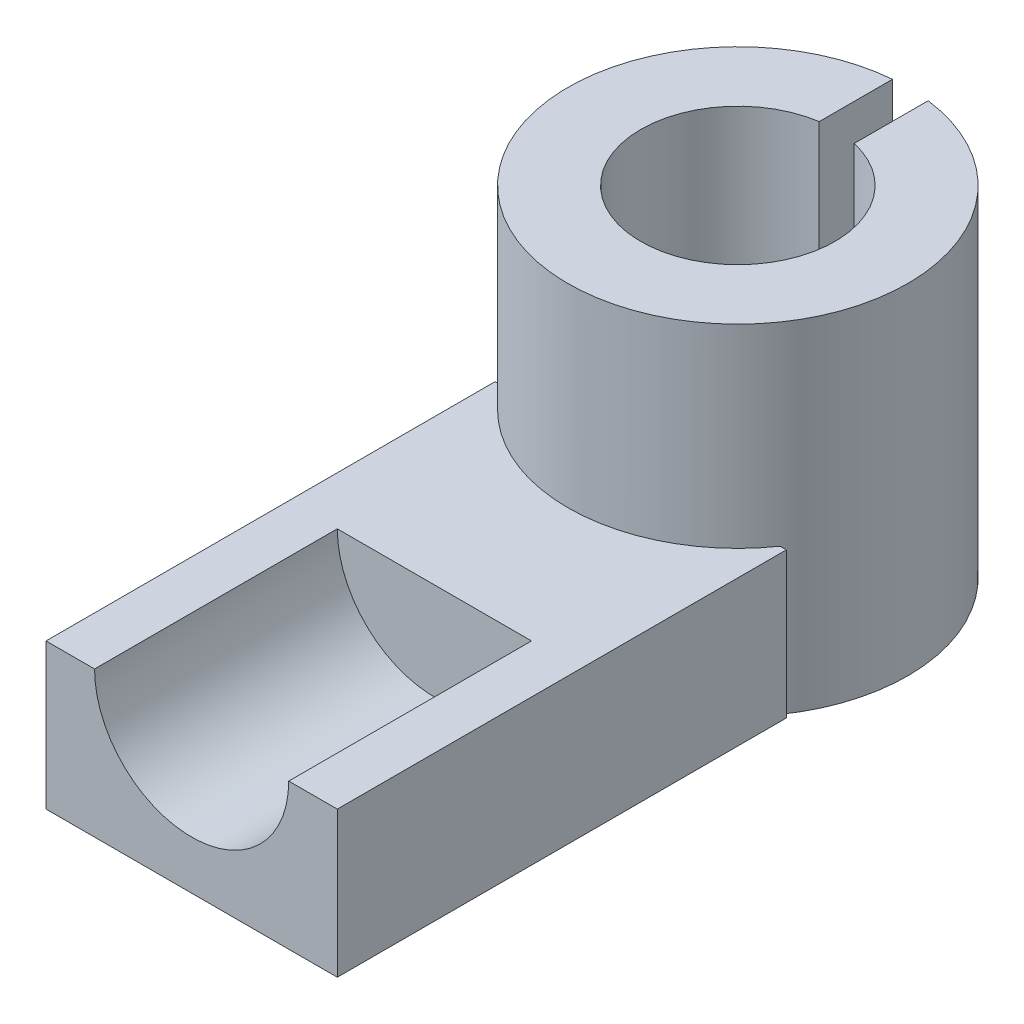
ISO-10303-21;
HEADER;
FILE_DESCRIPTION(('STEP AP214'),'2;1');
FILE_NAME('part.step','',(''),(''),'','','');
FILE_SCHEMA(('AUTOMOTIVE_DESIGN { 1 0 10303 214 1 1 1 1 }'));
ENDSEC;
DATA;
#1=APPLICATION_CONTEXT('core data for automotive mechanical design processes');
#2=APPLICATION_PROTOCOL_DEFINITION('international standard','automotive_design',2000,#1);
#3=PRODUCT_CONTEXT('',#1,'mechanical');
#4=PRODUCT('Part','Part','',(#3));
#5=PRODUCT_RELATED_PRODUCT_CATEGORY('part','',(#4));
#6=PRODUCT_DEFINITION_FORMATION('','',#4);
#7=PRODUCT_DEFINITION_CONTEXT('part definition',#1,'design');
#8=PRODUCT_DEFINITION('design','',#6,#7);
#9=PRODUCT_DEFINITION_SHAPE('','',#8);
#10=(LENGTH_UNIT() NAMED_UNIT(*) SI_UNIT(.MILLI.,.METRE.));
#11=(NAMED_UNIT(*) PLANE_ANGLE_UNIT() SI_UNIT($,.RADIAN.));
#12=(NAMED_UNIT(*) SI_UNIT($,.STERADIAN.) SOLID_ANGLE_UNIT());
#13=UNCERTAINTY_MEASURE_WITH_UNIT(LENGTH_MEASURE(1.E-05),#10,'distance_accuracy_value','');
#14=(GEOMETRIC_REPRESENTATION_CONTEXT(3) GLOBAL_UNCERTAINTY_ASSIGNED_CONTEXT((#13)) GLOBAL_UNIT_ASSIGNED_CONTEXT((#10,
#11,#12)) REPRESENTATION_CONTEXT('',''));
#15=CARTESIAN_POINT('',(0.,0.,0.));
#16=DIRECTION('',(0.,0.,1.));
#17=DIRECTION('',(1.,0.,0.));
#18=AXIS2_PLACEMENT_3D('',#15,#16,#17);
#19=CARTESIAN_POINT('',(-24.,24.,90.));
#20=DIRECTION('',(0.,0.,1.));
#21=DIRECTION('',(1.,0.,0.));
#22=AXIS2_PLACEMENT_3D('',#19,#20,#21);
#23=PLANE('',#22);
#24=DIRECTION('',(-1.,0.,0.));
#25=VECTOR('',#24,1.);
#26=CARTESIAN_POINT('',(-24.,24.,90.));
#27=LINE('',#26,#25);
#28=CARTESIAN_POINT('',(24.,24.,90.));
#29=VERTEX_POINT('',#28);
#30=CARTESIAN_POINT('',(16.,24.,90.));
#31=VERTEX_POINT('',#30);
#32=EDGE_CURVE('E165',#29,#31,#27,.T.);
#33=ORIENTED_EDGE('',*,*,#32,.T.);
#34=CARTESIAN_POINT('',(0.,24.,90.));
#35=DIRECTION('',(0.,0.,1.));
#36=DIRECTION('',(1.,0.,0.));
#37=AXIS2_PLACEMENT_3D('',#34,#35,#36);
#38=CIRCLE('',#37,16.);
#39=CARTESIAN_POINT('',(-16.,24.,90.));
#40=VERTEX_POINT('',#39);
#41=EDGE_CURVE('E63',#40,#31,#38,.T.);
#42=ORIENTED_EDGE('',*,*,#41,.F.);
#43=CARTESIAN_POINT('',(-24.,24.,90.));
#44=VERTEX_POINT('',#43);
#45=EDGE_CURVE('E130',#40,#44,#27,.T.);
#46=ORIENTED_EDGE('',*,*,#45,.T.);
#47=DIRECTION('',(0.,-1.,0.));
#48=VECTOR('',#47,1.);
#49=CARTESIAN_POINT('',(-24.,24.,90.));
#50=LINE('',#49,#48);
#51=CARTESIAN_POINT('',(-24.,0.,90.));
#52=VERTEX_POINT('',#51);
#53=EDGE_CURVE('E184',#44,#52,#50,.T.);
#54=ORIENTED_EDGE('',*,*,#53,.T.);
#55=DIRECTION('',(-1.,0.,0.));
#56=VECTOR('',#55,1.);
#57=CARTESIAN_POINT('',(-24.,0.,90.));
#58=LINE('',#57,#56);
#59=CARTESIAN_POINT('',(24.,0.,90.));
#60=VERTEX_POINT('',#59);
#61=EDGE_CURVE('E156',#60,#52,#58,.T.);
#62=ORIENTED_EDGE('',*,*,#61,.F.);
#63=DIRECTION('',(0.,-1.,0.));
#64=VECTOR('',#63,1.);
#65=CARTESIAN_POINT('',(24.,24.,90.));
#66=LINE('',#65,#64);
#67=EDGE_CURVE('E188',#29,#60,#66,.T.);
#68=ORIENTED_EDGE('',*,*,#67,.F.);
#69=EDGE_LOOP('',(#33,#42,#46,#54,#62,#68));
#70=FACE_BOUND('',#69,.T.);
#71=ADVANCED_FACE('F39',(#70),#23,.T.);
#72=CARTESIAN_POINT('',(0.,24.,0.));
#73=DIRECTION('',(0.,-1.,0.));
#74=DIRECTION('',(0.,0.,-1.));
#75=AXIS2_PLACEMENT_3D('',#72,#73,#74);
#76=PLANE('',#75);
#77=DIRECTION('',(0.,0.,-1.));
#78=VECTOR('',#77,1.);
#79=CARTESIAN_POINT('',(-16.,24.,414.903726190688));
#80=LINE('',#79,#78);
#81=CARTESIAN_POINT('',(-16.,24.,50.));
#82=VERTEX_POINT('',#81);
#83=EDGE_CURVE('E127',#40,#82,#80,.T.);
#84=ORIENTED_EDGE('',*,*,#83,.T.);
#85=DIRECTION('',(-1.,0.,0.));
#86=VECTOR('',#85,1.);
#87=CARTESIAN_POINT('',(-24.,24.,50.));
#88=LINE('',#87,#86);
#89=CARTESIAN_POINT('',(16.,24.,50.));
#90=VERTEX_POINT('',#89);
#91=EDGE_CURVE('E55',#90,#82,#88,.T.);
#92=ORIENTED_EDGE('',*,*,#91,.F.);
#93=DIRECTION('',(0.,0.,-1.));
#94=VECTOR('',#93,1.);
#95=CARTESIAN_POINT('',(16.,24.,414.903726190688));
#96=LINE('',#95,#94);
#97=EDGE_CURVE('E134',#31,#90,#96,.T.);
#98=ORIENTED_EDGE('',*,*,#97,.F.);
#99=ORIENTED_EDGE('',*,*,#32,.F.);
#100=DIRECTION('',(0.,0.,1.));
#101=VECTOR('',#100,1.);
#102=CARTESIAN_POINT('',(24.,24.,90.));
#103=LINE('',#102,#101);
#104=CARTESIAN_POINT('',(24.,24.,16.));
#105=VERTEX_POINT('',#104);
#106=EDGE_CURVE('E161',#105,#29,#103,.T.);
#107=ORIENTED_EDGE('',*,*,#106,.F.);
#108=DIRECTION('',(1.,0.,0.));
#109=VECTOR('',#108,1.);
#110=CARTESIAN_POINT('',(-24.,24.,16.));
#111=LINE('',#110,#109);
#112=CARTESIAN_POINT('',(22.9782505861521,24.,16.));
#113=VERTEX_POINT('',#112);
#114=EDGE_CURVE('E155',#113,#105,#111,.T.);
#115=ORIENTED_EDGE('',*,*,#114,.F.);
#116=CARTESIAN_POINT('',(0.,24.,0.));
#117=DIRECTION('',(0.,-1.,0.));
#118=DIRECTION('',(0.,0.,-1.));
#119=AXIS2_PLACEMENT_3D('',#116,#117,#118);
#120=CIRCLE('',#119,28.);
#121=CARTESIAN_POINT('',(-22.9782505861521,24.,16.));
#122=VERTEX_POINT('',#121);
#123=EDGE_CURVE('E187',#113,#122,#120,.T.);
#124=ORIENTED_EDGE('',*,*,#123,.T.);
#125=CARTESIAN_POINT('',(-24.,24.,16.));
#126=VERTEX_POINT('',#125);
#127=EDGE_CURVE('E157',#126,#122,#111,.T.);
#128=ORIENTED_EDGE('',*,*,#127,.F.);
#129=DIRECTION('',(0.,0.,-1.));
#130=VECTOR('',#129,1.);
#131=CARTESIAN_POINT('',(-24.,24.,90.));
#132=LINE('',#131,#130);
#133=EDGE_CURVE('E151',#44,#126,#132,.T.);
#134=ORIENTED_EDGE('',*,*,#133,.F.);
#135=ORIENTED_EDGE('',*,*,#45,.F.);
#136=EDGE_LOOP('',(#84,#92,#98,#99,#107,#115,#124,#128,#134,#135));
#137=FACE_BOUND('',#136,.T.);
#138=ADVANCED_FACE('F128',(#137),#76,.F.);
#139=CARTESIAN_POINT('',(0.,56.,0.));
#140=DIRECTION('',(0.,1.,0.));
#141=DIRECTION('',(0.,0.,1.));
#142=AXIS2_PLACEMENT_3D('',#139,#140,#141);
#143=PLANE('',#142);
#144=DIRECTION('',(0.,0.,1.));
#145=VECTOR('',#144,1.);
#146=CARTESIAN_POINT('',(-2.40667704596222,56.,13.5082325864751));
#147=LINE('',#146,#145);
#148=CARTESIAN_POINT('',(-2.40667704596222,56.,-27.89637800139));
#149=VERTEX_POINT('',#148);
#150=CARTESIAN_POINT('',(-2.40667704596222,56.,-15.8179614867542));
#151=VERTEX_POINT('',#150);
#152=EDGE_CURVE('E207',#149,#151,#147,.T.);
#153=ORIENTED_EDGE('',*,*,#152,.F.);
#154=CARTESIAN_POINT('',(0.,56.,0.));
#155=DIRECTION('',(0.,1.,0.));
#156=DIRECTION('',(0.,0.,1.));
#157=AXIS2_PLACEMENT_3D('',#154,#155,#156);
#158=CIRCLE('',#157,28.);
#159=CARTESIAN_POINT('',(3.59332295403778,56.,-27.768471872755));
#160=VERTEX_POINT('',#159);
#161=EDGE_CURVE('E237',#149,#160,#158,.T.);
#162=ORIENTED_EDGE('',*,*,#161,.T.);
#163=DIRECTION('',(0.,0.,-1.));
#164=VECTOR('',#163,1.);
#165=CARTESIAN_POINT('',(3.59332295403778,56.,13.5082325864751));
#166=LINE('',#165,#164);
#167=CARTESIAN_POINT('',(3.59332295403778,56.,-15.59128058076));
#168=VERTEX_POINT('',#167);
#169=EDGE_CURVE('E213',#168,#160,#166,.T.);
#170=ORIENTED_EDGE('',*,*,#169,.F.);
#171=CARTESIAN_POINT('',(0.,56.,0.));
#172=DIRECTION('',(0.,1.,0.));
#173=DIRECTION('',(0.,0.,1.));
#174=AXIS2_PLACEMENT_3D('',#171,#172,#173);
#175=CIRCLE('',#174,16.);
#176=EDGE_CURVE('E230',#151,#168,#175,.T.);
#177=ORIENTED_EDGE('',*,*,#176,.F.);
#178=EDGE_LOOP('',(#153,#162,#170,#177));
#179=FACE_BOUND('',#178,.T.);
#180=ADVANCED_FACE('F255',(#179),#143,.T.);
#181=CARTESIAN_POINT('',(0.,0.,0.));
#182=DIRECTION('',(0.,1.,0.));
#183=DIRECTION('',(0.,0.,1.));
#184=AXIS2_PLACEMENT_3D('',#181,#182,#183);
#185=PLANE('',#184);
#186=CARTESIAN_POINT('',(0.,0.,0.));
#187=DIRECTION('',(0.,1.,0.));
#188=DIRECTION('',(0.,0.,1.));
#189=AXIS2_PLACEMENT_3D('',#186,#187,#188);
#190=CIRCLE('',#189,16.);
#191=CARTESIAN_POINT('',(-2.40667704596222,0.,-15.8179614867542));
#192=VERTEX_POINT('',#191);
#193=CARTESIAN_POINT('',(3.59332295403778,0.,-15.59128058076));
#194=VERTEX_POINT('',#193);
#195=EDGE_CURVE('E229',#192,#194,#190,.T.);
#196=ORIENTED_EDGE('',*,*,#195,.T.);
#197=DIRECTION('',(0.,0.,-1.));
#198=VECTOR('',#197,1.);
#199=CARTESIAN_POINT('',(3.59332295403778,0.,13.5082325864751));
#200=LINE('',#199,#198);
#201=CARTESIAN_POINT('',(3.59332295403778,0.,-27.768471872755));
#202=VERTEX_POINT('',#201);
#203=EDGE_CURVE('E212',#194,#202,#200,.T.);
#204=ORIENTED_EDGE('',*,*,#203,.T.);
#205=CARTESIAN_POINT('',(0.,0.,0.));
#206=DIRECTION('',(0.,1.,0.));
#207=DIRECTION('',(0.,0.,1.));
#208=AXIS2_PLACEMENT_3D('',#205,#206,#207);
#209=CIRCLE('',#208,28.);
#210=CARTESIAN_POINT('',(22.9782505861521,0.,16.));
#211=VERTEX_POINT('',#210);
#212=EDGE_CURVE('E234',#211,#202,#209,.T.);
#213=ORIENTED_EDGE('',*,*,#212,.F.);
#214=DIRECTION('',(1.,0.,0.));
#215=VECTOR('',#214,1.);
#216=CARTESIAN_POINT('',(-24.,0.,16.));
#217=LINE('',#216,#215);
#218=CARTESIAN_POINT('',(24.,0.,16.));
#219=VERTEX_POINT('',#218);
#220=EDGE_CURVE('E172',#211,#219,#217,.T.);
#221=ORIENTED_EDGE('',*,*,#220,.T.);
#222=DIRECTION('',(0.,0.,1.));
#223=VECTOR('',#222,1.);
#224=CARTESIAN_POINT('',(24.,0.,90.));
#225=LINE('',#224,#223);
#226=EDGE_CURVE('E177',#219,#60,#225,.T.);
#227=ORIENTED_EDGE('',*,*,#226,.T.);
#228=ORIENTED_EDGE('',*,*,#61,.T.);
#229=DIRECTION('',(0.,0.,-1.));
#230=VECTOR('',#229,1.);
#231=CARTESIAN_POINT('',(-24.,0.,90.));
#232=LINE('',#231,#230);
#233=CARTESIAN_POINT('',(-24.,0.,16.));
#234=VERTEX_POINT('',#233);
#235=EDGE_CURVE('E149',#52,#234,#232,.T.);
#236=ORIENTED_EDGE('',*,*,#235,.T.);
#237=CARTESIAN_POINT('',(-22.9782505861521,0.,16.));
#238=VERTEX_POINT('',#237);
#239=EDGE_CURVE('E173',#234,#238,#217,.T.);
#240=ORIENTED_EDGE('',*,*,#239,.T.);
#241=CARTESIAN_POINT('',(-2.40667704596222,0.,-27.89637800139));
#242=VERTEX_POINT('',#241);
#243=EDGE_CURVE('E241',#242,#238,#209,.T.);
#244=ORIENTED_EDGE('',*,*,#243,.F.);
#245=DIRECTION('',(0.,0.,1.));
#246=VECTOR('',#245,1.);
#247=CARTESIAN_POINT('',(-2.40667704596222,0.,13.5082325864751));
#248=LINE('',#247,#246);
#249=EDGE_CURVE('E208',#242,#192,#248,.T.);
#250=ORIENTED_EDGE('',*,*,#249,.T.);
#251=EDGE_LOOP('',(#196,#204,#213,#221,#227,#228,#236,#240,#244,#250));
#252=FACE_BOUND('',#251,.T.);
#253=ADVANCED_FACE('F263',(#252),#185,.F.);
#254=CARTESIAN_POINT('',(0.,56.,0.));
#255=DIRECTION('',(0.,-1.,0.));
#256=DIRECTION('',(0.,0.,-1.));
#257=AXIS2_PLACEMENT_3D('',#254,#255,#256);
#258=CYLINDRICAL_SURFACE('',#257,28.);
#259=ORIENTED_EDGE('',*,*,#123,.F.);
#260=DIRECTION('',(0.,-1.,0.));
#261=VECTOR('',#260,1.);
#262=CARTESIAN_POINT('',(22.9782505861521,56.,16.));
#263=LINE('',#262,#261);
#264=EDGE_CURVE('E203',#113,#211,#263,.T.);
#265=ORIENTED_EDGE('',*,*,#264,.T.);
#266=ORIENTED_EDGE('',*,*,#212,.T.);
#267=DIRECTION('',(0.,-1.,0.));
#268=VECTOR('',#267,1.);
#269=CARTESIAN_POINT('',(3.59332295403778,56.,-27.768471872755));
#270=LINE('',#269,#268);
#271=EDGE_CURVE('E217',#202,#160,#270,.F.);
#272=ORIENTED_EDGE('',*,*,#271,.T.);
#273=ORIENTED_EDGE('',*,*,#161,.F.);
#274=DIRECTION('',(0.,-1.,0.));
#275=VECTOR('',#274,1.);
#276=CARTESIAN_POINT('',(-2.40667704596222,56.,-27.89637800139));
#277=LINE('',#276,#275);
#278=EDGE_CURVE('E225',#149,#242,#277,.T.);
#279=ORIENTED_EDGE('',*,*,#278,.T.);
#280=ORIENTED_EDGE('',*,*,#243,.T.);
#281=DIRECTION('',(0.,-1.,0.));
#282=VECTOR('',#281,1.);
#283=CARTESIAN_POINT('',(-22.9782505861521,56.,16.));
#284=LINE('',#283,#282);
#285=EDGE_CURVE('E200',#238,#122,#284,.F.);
#286=ORIENTED_EDGE('',*,*,#285,.T.);
#287=EDGE_LOOP('',(#259,#265,#266,#272,#273,#279,#280,#286));
#288=FACE_BOUND('',#287,.T.);
#289=ADVANCED_FACE('F41',(#288),#258,.T.);
#290=CARTESIAN_POINT('',(0.,56.,0.));
#291=DIRECTION('',(0.,-1.,0.));
#292=DIRECTION('',(0.,0.,-1.));
#293=AXIS2_PLACEMENT_3D('',#290,#291,#292);
#294=CYLINDRICAL_SURFACE('',#293,16.);
#295=DIRECTION('',(0.,-1.,0.));
#296=VECTOR('',#295,1.);
#297=CARTESIAN_POINT('',(3.59332295403778,56.,-15.59128058076));
#298=LINE('',#297,#296);
#299=EDGE_CURVE('E48',#194,#168,#298,.F.);
#300=ORIENTED_EDGE('',*,*,#299,.F.);
#301=ORIENTED_EDGE('',*,*,#195,.F.);
#302=DIRECTION('',(0.,-1.,0.));
#303=VECTOR('',#302,1.);
#304=CARTESIAN_POINT('',(-2.40667704596222,56.,-15.8179614867542));
#305=LINE('',#304,#303);
#306=EDGE_CURVE('E11',#151,#192,#305,.T.);
#307=ORIENTED_EDGE('',*,*,#306,.F.);
#308=ORIENTED_EDGE('',*,*,#176,.T.);
#309=EDGE_LOOP('',(#300,#301,#307,#308));
#310=FACE_BOUND('',#309,.T.);
#311=ADVANCED_FACE('F258',(#310),#294,.F.);
#312=CARTESIAN_POINT('',(3.59332295403778,0.,13.5082325864751));
#313=DIRECTION('',(1.,0.,0.));
#314=DIRECTION('',(0.,0.,-1.));
#315=AXIS2_PLACEMENT_3D('',#312,#313,#314);
#316=PLANE('',#315);
#317=ORIENTED_EDGE('',*,*,#203,.F.);
#318=ORIENTED_EDGE('',*,*,#299,.T.);
#319=ORIENTED_EDGE('',*,*,#169,.T.);
#320=ORIENTED_EDGE('',*,*,#271,.F.);
#321=EDGE_LOOP('',(#317,#318,#319,#320));
#322=FACE_BOUND('',#321,.T.);
#323=ADVANCED_FACE('F248',(#322),#316,.F.);
#324=CARTESIAN_POINT('',(-2.40667704596222,0.,13.5082325864751));
#325=DIRECTION('',(-1.,0.,0.));
#326=DIRECTION('',(0.,0.,1.));
#327=AXIS2_PLACEMENT_3D('',#324,#325,#326);
#328=PLANE('',#327);
#329=ORIENTED_EDGE('',*,*,#152,.T.);
#330=ORIENTED_EDGE('',*,*,#306,.T.);
#331=ORIENTED_EDGE('',*,*,#249,.F.);
#332=ORIENTED_EDGE('',*,*,#278,.F.);
#333=EDGE_LOOP('',(#329,#330,#331,#332));
#334=FACE_BOUND('',#333,.T.);
#335=ADVANCED_FACE('F260',(#334),#328,.F.);
#336=CARTESIAN_POINT('',(-24.,24.,16.));
#337=DIRECTION('',(0.,0.,-1.));
#338=DIRECTION('',(-1.,0.,0.));
#339=AXIS2_PLACEMENT_3D('',#336,#337,#338);
#340=PLANE('',#339);
#341=ORIENTED_EDGE('',*,*,#264,.F.);
#342=ORIENTED_EDGE('',*,*,#114,.T.);
#343=DIRECTION('',(0.,-1.,0.));
#344=VECTOR('',#343,1.);
#345=CARTESIAN_POINT('',(24.,24.,16.));
#346=LINE('',#345,#344);
#347=EDGE_CURVE('E191',#105,#219,#346,.T.);
#348=ORIENTED_EDGE('',*,*,#347,.T.);
#349=ORIENTED_EDGE('',*,*,#220,.F.);
#350=EDGE_LOOP('',(#341,#342,#348,#349));
#351=FACE_BOUND('',#350,.T.);
#352=ADVANCED_FACE('F284',(#351),#340,.T.);
#353=ORIENTED_EDGE('',*,*,#285,.F.);
#354=ORIENTED_EDGE('',*,*,#239,.F.);
#355=DIRECTION('',(0.,-1.,0.));
#356=VECTOR('',#355,1.);
#357=CARTESIAN_POINT('',(-24.,24.,16.));
#358=LINE('',#357,#356);
#359=EDGE_CURVE('E168',#126,#234,#358,.T.);
#360=ORIENTED_EDGE('',*,*,#359,.F.);
#361=ORIENTED_EDGE('',*,*,#127,.T.);
#362=EDGE_LOOP('',(#353,#354,#360,#361));
#363=FACE_BOUND('',#362,.T.);
#364=ADVANCED_FACE('F268',(#363),#340,.T.);
#365=CARTESIAN_POINT('',(-24.,24.,90.));
#366=DIRECTION('',(-1.,0.,0.));
#367=DIRECTION('',(0.,0.,1.));
#368=AXIS2_PLACEMENT_3D('',#365,#366,#367);
#369=PLANE('',#368);
#370=ORIENTED_EDGE('',*,*,#235,.F.);
#371=ORIENTED_EDGE('',*,*,#53,.F.);
#372=ORIENTED_EDGE('',*,*,#133,.T.);
#373=ORIENTED_EDGE('',*,*,#359,.T.);
#374=EDGE_LOOP('',(#370,#371,#372,#373));
#375=FACE_BOUND('',#374,.T.);
#376=ADVANCED_FACE('F274',(#375),#369,.T.);
#377=CARTESIAN_POINT('',(24.,24.,90.));
#378=DIRECTION('',(1.,0.,0.));
#379=DIRECTION('',(0.,0.,-1.));
#380=AXIS2_PLACEMENT_3D('',#377,#378,#379);
#381=PLANE('',#380);
#382=ORIENTED_EDGE('',*,*,#226,.F.);
#383=ORIENTED_EDGE('',*,*,#347,.F.);
#384=ORIENTED_EDGE('',*,*,#106,.T.);
#385=ORIENTED_EDGE('',*,*,#67,.T.);
#386=EDGE_LOOP('',(#382,#383,#384,#385));
#387=FACE_BOUND('',#386,.T.);
#388=ADVANCED_FACE('F287',(#387),#381,.T.);
#389=CARTESIAN_POINT('',(0.,24.,414.903726190688));
#390=DIRECTION('',(0.,0.,-1.));
#391=DIRECTION('',(-1.,0.,0.));
#392=AXIS2_PLACEMENT_3D('',#389,#390,#391);
#393=CYLINDRICAL_SURFACE('',#392,16.);
#394=ORIENTED_EDGE('',*,*,#83,.F.);
#395=ORIENTED_EDGE('',*,*,#41,.T.);
#396=ORIENTED_EDGE('',*,*,#97,.T.);
#397=CARTESIAN_POINT('',(0.,24.,50.));
#398=DIRECTION('',(0.,0.,1.));
#399=DIRECTION('',(1.,0.,0.));
#400=AXIS2_PLACEMENT_3D('',#397,#398,#399);
#401=CIRCLE('',#400,16.);
#402=EDGE_CURVE('E138',#82,#90,#401,.T.);
#403=ORIENTED_EDGE('',*,*,#402,.F.);
#404=EDGE_LOOP('',(#394,#395,#396,#403));
#405=FACE_BOUND('',#404,.T.);
#406=ADVANCED_FACE('F142',(#405),#393,.F.);
#407=CARTESIAN_POINT('',(-24.,24.,50.));
#408=DIRECTION('',(0.,0.,1.));
#409=DIRECTION('',(1.,0.,0.));
#410=AXIS2_PLACEMENT_3D('',#407,#408,#409);
#411=PLANE('',#410);
#412=ORIENTED_EDGE('',*,*,#402,.T.);
#413=ORIENTED_EDGE('',*,*,#91,.T.);
#414=EDGE_LOOP('',(#412,#413));
#415=FACE_BOUND('',#414,.T.);
#416=ADVANCED_FACE('F137',(#415),#411,.T.);
#417=CLOSED_SHELL('',(#71,#138,#180,#253,#289,#311,#323,#335,#352,#364,#376,#388,#406,#416));
#418=MANIFOLD_SOLID_BREP('B2',#417);
#419=ADVANCED_BREP_SHAPE_REPRESENTATION('',(#18,#418),#14);
#420=SHAPE_DEFINITION_REPRESENTATION(#9,#419);
ENDSEC;
END-ISO-10303-21;
